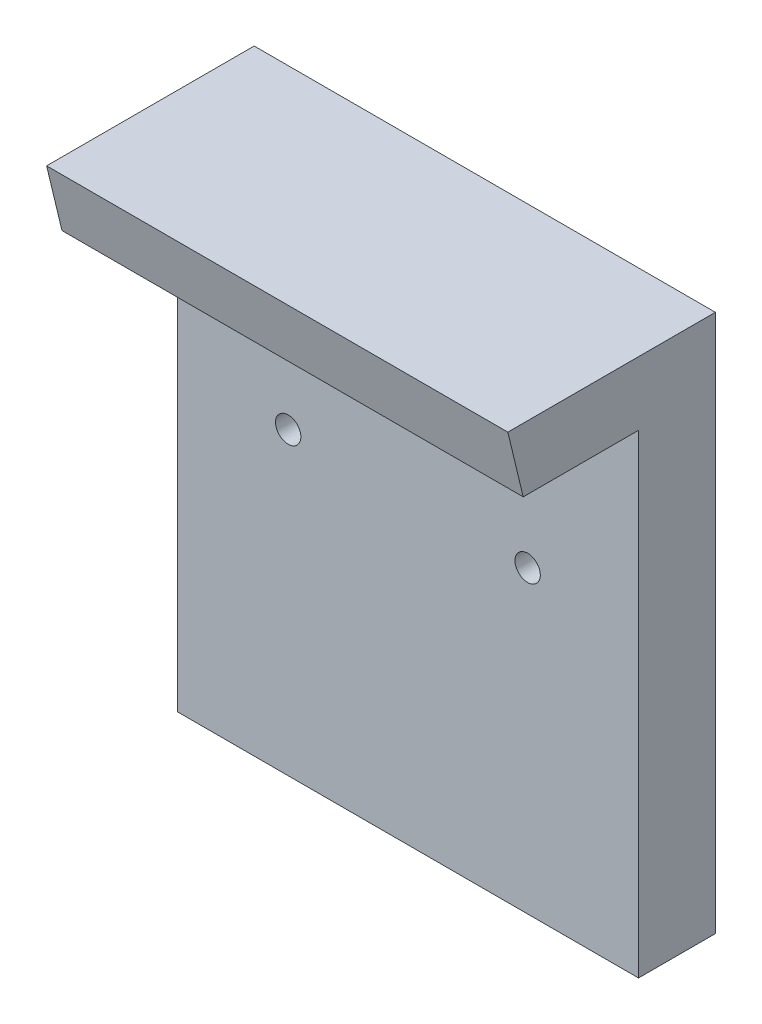
ISO-10303-21;
HEADER;
FILE_DESCRIPTION(('STEP AP214'),'2;1');
FILE_NAME('part.step','',(''),(''),'','','');
FILE_SCHEMA(('AUTOMOTIVE_DESIGN { 1 0 10303 214 1 1 1 1 }'));
ENDSEC;
DATA;
#1=APPLICATION_CONTEXT('core data for automotive mechanical design processes');
#2=APPLICATION_PROTOCOL_DEFINITION('international standard','automotive_design',2000,#1);
#3=PRODUCT_CONTEXT('',#1,'mechanical');
#4=PRODUCT('Part','Part','',(#3));
#5=PRODUCT_RELATED_PRODUCT_CATEGORY('part','',(#4));
#6=PRODUCT_DEFINITION_FORMATION('','',#4);
#7=PRODUCT_DEFINITION_CONTEXT('part definition',#1,'design');
#8=PRODUCT_DEFINITION('design','',#6,#7);
#9=PRODUCT_DEFINITION_SHAPE('','',#8);
#10=(LENGTH_UNIT() NAMED_UNIT(*) SI_UNIT(.MILLI.,.METRE.));
#11=(NAMED_UNIT(*) PLANE_ANGLE_UNIT() SI_UNIT($,.RADIAN.));
#12=(NAMED_UNIT(*) SI_UNIT($,.STERADIAN.) SOLID_ANGLE_UNIT());
#13=UNCERTAINTY_MEASURE_WITH_UNIT(LENGTH_MEASURE(1.E-05),#10,'distance_accuracy_value','');
#14=(GEOMETRIC_REPRESENTATION_CONTEXT(3) GLOBAL_UNCERTAINTY_ASSIGNED_CONTEXT((#13)) GLOBAL_UNIT_ASSIGNED_CONTEXT((#10,
#11,#12)) REPRESENTATION_CONTEXT('',''));
#15=CARTESIAN_POINT('',(0.,0.,0.));
#16=DIRECTION('',(0.,0.,1.));
#17=DIRECTION('',(1.,0.,0.));
#18=AXIS2_PLACEMENT_3D('',#15,#16,#17);
#19=CARTESIAN_POINT('',(0.,0.,0.));
#20=DIRECTION('',(0.,0.,1.));
#21=DIRECTION('',(1.,0.,0.));
#22=AXIS2_PLACEMENT_3D('',#19,#20,#21);
#23=PLANE('',#22);
#24=CARTESIAN_POINT('',(-12.4985974316947,-11.684931506849,0.));
#25=DIRECTION('',(0.,0.,-1.));
#26=DIRECTION('',(-1.,0.,0.));
#27=AXIS2_PLACEMENT_3D('',#24,#25,#26);
#28=CIRCLE('',#27,1.65);
#29=CARTESIAN_POINT('',(-14.1485974316947,-11.684931506849,0.));
#30=VERTEX_POINT('',#29);
#31=EDGE_CURVE('E119',#30,#30,#28,.T.);
#32=ORIENTED_EDGE('',*,*,#31,.F.);
#33=EDGE_LOOP('',(#32));
#34=FACE_BOUND('',#33,.T.);
#35=DIRECTION('',(0.,-1.,0.));
#36=VECTOR('',#35,1.);
#37=CARTESIAN_POINT('',(-26.9235974316948,19.3150684931507,0.));
#38=LINE('',#37,#36);
#39=CARTESIAN_POINT('',(-26.9235974316948,19.3150684931507,0.));
#40=VERTEX_POINT('',#39);
#41=CARTESIAN_POINT('',(-26.9235974316948,-50.6849315068493,0.));
#42=VERTEX_POINT('',#41);
#43=EDGE_CURVE('E98',#40,#42,#38,.T.);
#44=ORIENTED_EDGE('',*,*,#43,.F.);
#45=DIRECTION('',(-1.,0.,0.));
#46=VECTOR('',#45,1.);
#47=CARTESIAN_POINT('',(-26.9235974316948,19.3150684931507,0.));
#48=LINE('',#47,#46);
#49=CARTESIAN_POINT('',(33.0764025683052,19.3150684931507,0.));
#50=VERTEX_POINT('',#49);
#51=EDGE_CURVE('E79',#50,#40,#48,.T.);
#52=ORIENTED_EDGE('',*,*,#51,.F.);
#53=DIRECTION('',(0.,1.,0.));
#54=VECTOR('',#53,1.);
#55=CARTESIAN_POINT('',(33.0764025683052,19.3150684931507,0.));
#56=LINE('',#55,#54);
#57=CARTESIAN_POINT('',(33.0764025683052,-50.6849315068493,0.));
#58=VERTEX_POINT('',#57);
#59=EDGE_CURVE('E92',#58,#50,#56,.T.);
#60=ORIENTED_EDGE('',*,*,#59,.F.);
#61=DIRECTION('',(1.,0.,0.));
#62=VECTOR('',#61,1.);
#63=CARTESIAN_POINT('',(-26.9235974316948,-50.6849315068493,0.));
#64=LINE('',#63,#62);
#65=EDGE_CURVE('E105',#42,#58,#64,.T.);
#66=ORIENTED_EDGE('',*,*,#65,.F.);
#67=EDGE_LOOP('',(#44,#52,#60,#66));
#68=FACE_BOUND('',#67,.T.);
#69=CARTESIAN_POINT('',(18.6514025683052,-11.684931506849,0.));
#70=DIRECTION('',(0.,0.,-1.));
#71=DIRECTION('',(-1.,0.,0.));
#72=AXIS2_PLACEMENT_3D('',#69,#70,#71);
#73=CIRCLE('',#72,1.65);
#74=CARTESIAN_POINT('',(17.0014025683052,-11.684931506849,0.));
#75=VERTEX_POINT('',#74);
#76=EDGE_CURVE('E130',#75,#75,#73,.T.);
#77=ORIENTED_EDGE('',*,*,#76,.F.);
#78=EDGE_LOOP('',(#77));
#79=FACE_BOUND('',#78,.T.);
#80=ADVANCED_FACE('F36',(#34,#68,#79),#23,.F.);
#81=CARTESIAN_POINT('',(-26.9235974316948,19.3150684931507,10.));
#82=DIRECTION('',(1.,0.,0.));
#83=DIRECTION('',(0.,1.,0.));
#84=AXIS2_PLACEMENT_3D('',#81,#82,#83);
#85=PLANE('',#84);
#86=ORIENTED_EDGE('',*,*,#43,.T.);
#87=DIRECTION('',(0.,0.,-1.));
#88=VECTOR('',#87,1.);
#89=CARTESIAN_POINT('',(-26.9235974316948,-50.6849315068493,10.));
#90=LINE('',#89,#88);
#91=CARTESIAN_POINT('',(-26.9235974316948,-50.6849315068493,10.));
#92=VERTEX_POINT('',#91);
#93=EDGE_CURVE('E11',#92,#42,#90,.T.);
#94=ORIENTED_EDGE('',*,*,#93,.F.);
#95=DIRECTION('',(0.,-1.,0.));
#96=VECTOR('',#95,1.);
#97=CARTESIAN_POINT('',(-26.9235974316948,19.3150684931507,10.));
#98=LINE('',#97,#96);
#99=CARTESIAN_POINT('',(-26.9235974316948,11.0188260613045,10.));
#100=VERTEX_POINT('',#99);
#101=EDGE_CURVE('E91',#100,#92,#98,.T.);
#102=ORIENTED_EDGE('',*,*,#101,.F.);
#103=DIRECTION('',(0.,0.,-1.));
#104=VECTOR('',#103,1.);
#105=CARTESIAN_POINT('',(-26.9235974316948,11.0188260613045,10.));
#106=LINE('',#105,#104);
#107=CARTESIAN_POINT('',(-26.9235974316948,11.0188260613045,25.));
#108=VERTEX_POINT('',#107);
#109=EDGE_CURVE('E134',#108,#100,#106,.T.);
#110=ORIENTED_EDGE('',*,*,#109,.F.);
#111=DIRECTION('',(0.,-0.972150089751805,-0.234359132520065));
#112=VECTOR('',#111,1.);
#113=CARTESIAN_POINT('',(-26.9235974316948,19.3150684931507,27.));
#114=LINE('',#113,#112);
#115=CARTESIAN_POINT('',(-26.9235974316948,19.3150684931507,27.));
#116=VERTEX_POINT('',#115);
#117=EDGE_CURVE('E101',#116,#108,#114,.T.);
#118=ORIENTED_EDGE('',*,*,#117,.F.);
#119=DIRECTION('',(0.,0.,-1.));
#120=VECTOR('',#119,1.);
#121=CARTESIAN_POINT('',(-26.9235974316948,19.3150684931507,10.));
#122=LINE('',#121,#120);
#123=EDGE_CURVE('E84',#116,#40,#122,.T.);
#124=ORIENTED_EDGE('',*,*,#123,.T.);
#125=EDGE_LOOP('',(#86,#94,#102,#110,#118,#124));
#126=FACE_BOUND('',#125,.T.);
#127=ADVANCED_FACE('F38',(#126),#85,.F.);
#128=CARTESIAN_POINT('',(-26.9235974316948,-50.6849315068493,10.));
#129=DIRECTION('',(0.,1.,0.));
#130=DIRECTION('',(0.,0.,1.));
#131=AXIS2_PLACEMENT_3D('',#128,#129,#130);
#132=PLANE('',#131);
#133=ORIENTED_EDGE('',*,*,#65,.T.);
#134=DIRECTION('',(0.,0.,-1.));
#135=VECTOR('',#134,1.);
#136=CARTESIAN_POINT('',(33.0764025683052,-50.6849315068493,10.));
#137=LINE('',#136,#135);
#138=CARTESIAN_POINT('',(33.0764025683052,-50.6849315068493,10.));
#139=VERTEX_POINT('',#138);
#140=EDGE_CURVE('E45',#139,#58,#137,.T.);
#141=ORIENTED_EDGE('',*,*,#140,.F.);
#142=DIRECTION('',(1.,0.,0.));
#143=VECTOR('',#142,1.);
#144=CARTESIAN_POINT('',(-26.9235974316948,-50.6849315068493,10.));
#145=LINE('',#144,#143);
#146=EDGE_CURVE('E59',#92,#139,#145,.T.);
#147=ORIENTED_EDGE('',*,*,#146,.F.);
#148=ORIENTED_EDGE('',*,*,#93,.T.);
#149=EDGE_LOOP('',(#133,#141,#147,#148));
#150=FACE_BOUND('',#149,.T.);
#151=ADVANCED_FACE('F162',(#150),#132,.F.);
#152=CARTESIAN_POINT('',(33.0764025683052,19.3150684931507,10.));
#153=DIRECTION('',(-1.,0.,0.));
#154=DIRECTION('',(0.,0.,1.));
#155=AXIS2_PLACEMENT_3D('',#152,#153,#154);
#156=PLANE('',#155);
#157=ORIENTED_EDGE('',*,*,#59,.T.);
#158=DIRECTION('',(0.,0.,-1.));
#159=VECTOR('',#158,1.);
#160=CARTESIAN_POINT('',(33.0764025683052,19.3150684931507,10.));
#161=LINE('',#160,#159);
#162=CARTESIAN_POINT('',(33.0764025683052,19.3150684931507,27.));
#163=VERTEX_POINT('',#162);
#164=EDGE_CURVE('E87',#163,#50,#161,.T.);
#165=ORIENTED_EDGE('',*,*,#164,.F.);
#166=DIRECTION('',(0.,-0.972150089751805,-0.234359132520065));
#167=VECTOR('',#166,1.);
#168=CARTESIAN_POINT('',(33.0764025683052,19.3150684931507,27.));
#169=LINE('',#168,#167);
#170=CARTESIAN_POINT('',(33.0764025683052,11.0188260613045,25.));
#171=VERTEX_POINT('',#170);
#172=EDGE_CURVE('E118',#163,#171,#169,.T.);
#173=ORIENTED_EDGE('',*,*,#172,.T.);
#174=DIRECTION('',(0.,0.,-1.));
#175=VECTOR('',#174,1.);
#176=CARTESIAN_POINT('',(33.0764025683052,11.0188260613045,10.));
#177=LINE('',#176,#175);
#178=CARTESIAN_POINT('',(33.0764025683052,11.0188260613045,10.));
#179=VERTEX_POINT('',#178);
#180=EDGE_CURVE('E123',#171,#179,#177,.T.);
#181=ORIENTED_EDGE('',*,*,#180,.T.);
#182=DIRECTION('',(0.,1.,0.));
#183=VECTOR('',#182,1.);
#184=CARTESIAN_POINT('',(33.0764025683052,19.3150684931507,10.));
#185=LINE('',#184,#183);
#186=EDGE_CURVE('E102',#139,#179,#185,.T.);
#187=ORIENTED_EDGE('',*,*,#186,.F.);
#188=ORIENTED_EDGE('',*,*,#140,.T.);
#189=EDGE_LOOP('',(#157,#165,#173,#181,#187,#188));
#190=FACE_BOUND('',#189,.T.);
#191=ADVANCED_FACE('F152',(#190),#156,.F.);
#192=CARTESIAN_POINT('',(-26.9235974316948,19.3150684931507,10.));
#193=DIRECTION('',(0.,-1.,0.));
#194=DIRECTION('',(0.,0.,-1.));
#195=AXIS2_PLACEMENT_3D('',#192,#193,#194);
#196=PLANE('',#195);
#197=ORIENTED_EDGE('',*,*,#51,.T.);
#198=ORIENTED_EDGE('',*,*,#123,.F.);
#199=DIRECTION('',(1.,0.,0.));
#200=VECTOR('',#199,1.);
#201=CARTESIAN_POINT('',(-26.9235974316948,19.3150684931507,27.));
#202=LINE('',#201,#200);
#203=EDGE_CURVE('E136',#116,#163,#202,.T.);
#204=ORIENTED_EDGE('',*,*,#203,.T.);
#205=ORIENTED_EDGE('',*,*,#164,.T.);
#206=EDGE_LOOP('',(#197,#198,#204,#205));
#207=FACE_BOUND('',#206,.T.);
#208=ADVANCED_FACE('F81',(#207),#196,.F.);
#209=CARTESIAN_POINT('',(0.,0.,10.));
#210=DIRECTION('',(0.,0.,1.));
#211=DIRECTION('',(1.,0.,0.));
#212=AXIS2_PLACEMENT_3D('',#209,#210,#211);
#213=PLANE('',#212);
#214=CARTESIAN_POINT('',(18.6514025683052,-11.684931506849,10.));
#215=DIRECTION('',(0.,0.,1.));
#216=DIRECTION('',(1.,0.,0.));
#217=AXIS2_PLACEMENT_3D('',#214,#215,#216);
#218=CIRCLE('',#217,1.65);
#219=CARTESIAN_POINT('',(20.3014025683052,-11.684931506849,10.));
#220=VERTEX_POINT('',#219);
#221=EDGE_CURVE('E40',#220,#220,#218,.T.);
#222=ORIENTED_EDGE('',*,*,#221,.F.);
#223=EDGE_LOOP('',(#222));
#224=FACE_BOUND('',#223,.T.);
#225=CARTESIAN_POINT('',(-12.4985974316947,-11.684931506849,10.));
#226=DIRECTION('',(0.,0.,1.));
#227=DIRECTION('',(1.,0.,0.));
#228=AXIS2_PLACEMENT_3D('',#225,#226,#227);
#229=CIRCLE('',#228,1.65);
#230=CARTESIAN_POINT('',(-10.8485974316947,-11.684931506849,10.));
#231=VERTEX_POINT('',#230);
#232=EDGE_CURVE('E116',#231,#231,#229,.T.);
#233=ORIENTED_EDGE('',*,*,#232,.F.);
#234=EDGE_LOOP('',(#233));
#235=FACE_BOUND('',#234,.T.);
#236=DIRECTION('',(1.,0.,0.));
#237=VECTOR('',#236,1.);
#238=CARTESIAN_POINT('',(-26.9235974316948,11.0188260613045,10.));
#239=LINE('',#238,#237);
#240=EDGE_CURVE('E53',#100,#179,#239,.T.);
#241=ORIENTED_EDGE('',*,*,#240,.F.);
#242=ORIENTED_EDGE('',*,*,#101,.T.);
#243=ORIENTED_EDGE('',*,*,#146,.T.);
#244=ORIENTED_EDGE('',*,*,#186,.T.);
#245=EDGE_LOOP('',(#241,#242,#243,#244));
#246=FACE_BOUND('',#245,.T.);
#247=ADVANCED_FACE('F145',(#224,#235,#246),#213,.T.);
#248=CARTESIAN_POINT('',(-26.9235974316948,11.0188260613045,10.));
#249=DIRECTION('',(0.,-1.,0.));
#250=DIRECTION('',(0.,0.,-1.));
#251=AXIS2_PLACEMENT_3D('',#248,#249,#250);
#252=PLANE('',#251);
#253=ORIENTED_EDGE('',*,*,#180,.F.);
#254=DIRECTION('',(1.,0.,0.));
#255=VECTOR('',#254,1.);
#256=CARTESIAN_POINT('',(-26.9235974316948,11.0188260613045,25.));
#257=LINE('',#256,#255);
#258=EDGE_CURVE('E108',#108,#171,#257,.T.);
#259=ORIENTED_EDGE('',*,*,#258,.F.);
#260=ORIENTED_EDGE('',*,*,#109,.T.);
#261=ORIENTED_EDGE('',*,*,#240,.T.);
#262=EDGE_LOOP('',(#253,#259,#260,#261));
#263=FACE_BOUND('',#262,.T.);
#264=ADVANCED_FACE('F150',(#263),#252,.T.);
#265=CARTESIAN_POINT('',(-26.9235974316948,19.3150684931507,27.));
#266=DIRECTION('',(0.,-0.234359132520065,0.972150089751805));
#267=DIRECTION('',(0.,-0.972150089751805,-0.234359132520065));
#268=AXIS2_PLACEMENT_3D('',#265,#266,#267);
#269=PLANE('',#268);
#270=ORIENTED_EDGE('',*,*,#172,.F.);
#271=ORIENTED_EDGE('',*,*,#203,.F.);
#272=ORIENTED_EDGE('',*,*,#117,.T.);
#273=ORIENTED_EDGE('',*,*,#258,.T.);
#274=EDGE_LOOP('',(#270,#271,#272,#273));
#275=FACE_BOUND('',#274,.T.);
#276=ADVANCED_FACE('F157',(#275),#269,.T.);
#277=CARTESIAN_POINT('',(-12.4985974316947,-11.684931506849,0.));
#278=DIRECTION('',(0.,0.,-1.));
#279=DIRECTION('',(-1.,0.,0.));
#280=AXIS2_PLACEMENT_3D('',#277,#278,#279);
#281=CYLINDRICAL_SURFACE('',#280,1.65);
#282=ORIENTED_EDGE('',*,*,#232,.T.);
#283=EDGE_LOOP('',(#282));
#284=FACE_BOUND('',#283,.T.);
#285=ORIENTED_EDGE('',*,*,#31,.T.);
#286=EDGE_LOOP('',(#285));
#287=FACE_BOUND('',#286,.T.);
#288=ADVANCED_FACE('F192',(#284,#287),#281,.F.);
#289=CARTESIAN_POINT('',(18.6514025683052,-11.684931506849,0.));
#290=DIRECTION('',(0.,0.,-1.));
#291=DIRECTION('',(-1.,0.,0.));
#292=AXIS2_PLACEMENT_3D('',#289,#290,#291);
#293=CYLINDRICAL_SURFACE('',#292,1.65);
#294=ORIENTED_EDGE('',*,*,#221,.T.);
#295=EDGE_LOOP('',(#294));
#296=FACE_BOUND('',#295,.T.);
#297=ORIENTED_EDGE('',*,*,#76,.T.);
#298=EDGE_LOOP('',(#297));
#299=FACE_BOUND('',#298,.T.);
#300=ADVANCED_FACE('F189',(#296,#299),#293,.F.);
#301=CLOSED_SHELL('',(#80,#127,#151,#191,#208,#247,#264,#276,#288,#300));
#302=MANIFOLD_SOLID_BREP('B2',#301);
#303=ADVANCED_BREP_SHAPE_REPRESENTATION('',(#18,#302),#14);
#304=SHAPE_DEFINITION_REPRESENTATION(#9,#303);
ENDSEC;
END-ISO-10303-21;
